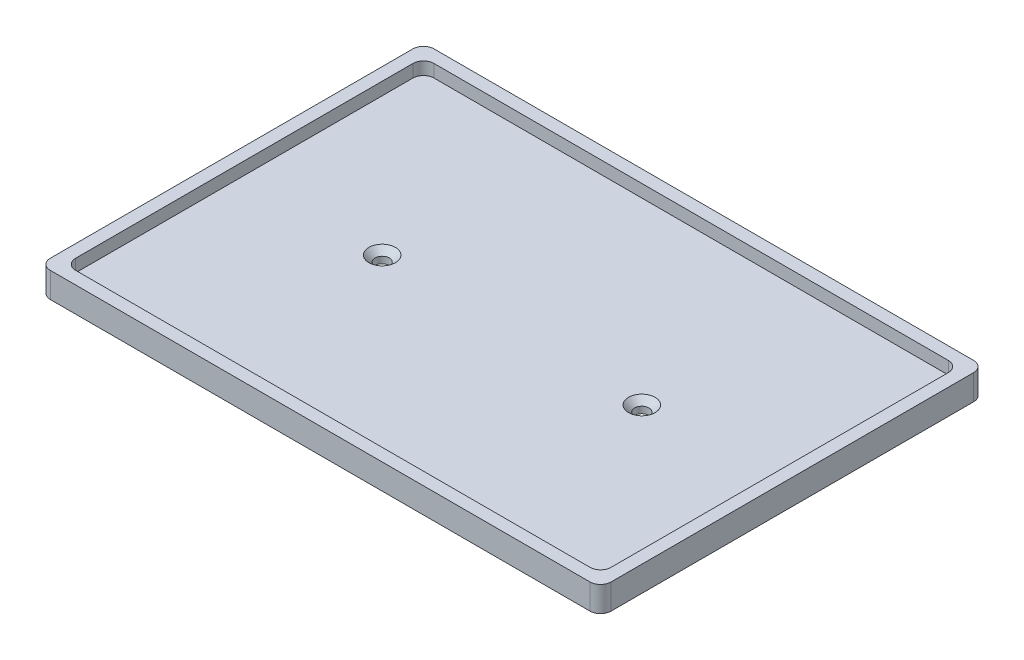
ISO-10303-21;
HEADER;
FILE_DESCRIPTION(('STEP AP214'),'2;1');
FILE_NAME('part.step','',(''),(''),'','','');
FILE_SCHEMA(('AUTOMOTIVE_DESIGN { 1 0 10303 214 1 1 1 1 }'));
ENDSEC;
DATA;
#1=APPLICATION_CONTEXT('core data for automotive mechanical design processes');
#2=APPLICATION_PROTOCOL_DEFINITION('international standard','automotive_design',2000,#1);
#3=PRODUCT_CONTEXT('',#1,'mechanical');
#4=PRODUCT('Part','Part','',(#3));
#5=PRODUCT_RELATED_PRODUCT_CATEGORY('part','',(#4));
#6=PRODUCT_DEFINITION_FORMATION('','',#4);
#7=PRODUCT_DEFINITION_CONTEXT('part definition',#1,'design');
#8=PRODUCT_DEFINITION('design','',#6,#7);
#9=PRODUCT_DEFINITION_SHAPE('','',#8);
#10=(LENGTH_UNIT() NAMED_UNIT(*) SI_UNIT(.MILLI.,.METRE.));
#11=(NAMED_UNIT(*) PLANE_ANGLE_UNIT() SI_UNIT($,.RADIAN.));
#12=(NAMED_UNIT(*) SI_UNIT($,.STERADIAN.) SOLID_ANGLE_UNIT());
#13=UNCERTAINTY_MEASURE_WITH_UNIT(LENGTH_MEASURE(1.E-05),#10,'distance_accuracy_value','');
#14=(GEOMETRIC_REPRESENTATION_CONTEXT(3) GLOBAL_UNCERTAINTY_ASSIGNED_CONTEXT((#13)) GLOBAL_UNIT_ASSIGNED_CONTEXT((#10,
#11,#12)) REPRESENTATION_CONTEXT('',''));
#15=CARTESIAN_POINT('',(0.,0.,0.));
#16=DIRECTION('',(0.,0.,1.));
#17=DIRECTION('',(1.,0.,0.));
#18=AXIS2_PLACEMENT_3D('',#15,#16,#17);
#19=CARTESIAN_POINT('',(66.5,6.,-45.5));
#20=DIRECTION('',(-1.,0.,0.));
#21=DIRECTION('',(0.,0.,1.));
#22=AXIS2_PLACEMENT_3D('',#19,#20,#21);
#23=PLANE('',#22);
#24=DIRECTION('',(0.,0.,-1.));
#25=VECTOR('',#24,1.);
#26=CARTESIAN_POINT('',(66.5,0.,-45.5));
#27=LINE('',#26,#25);
#28=CARTESIAN_POINT('',(66.5,0.,43.));
#29=VERTEX_POINT('',#28);
#30=CARTESIAN_POINT('',(66.5,0.,-43.));
#31=VERTEX_POINT('',#30);
#32=EDGE_CURVE('E180',#29,#31,#27,.T.);
#33=ORIENTED_EDGE('',*,*,#32,.T.);
#34=DIRECTION('',(0.,-1.,0.));
#35=VECTOR('',#34,1.);
#36=CARTESIAN_POINT('',(66.5,6.,-43.));
#37=LINE('',#36,#35);
#38=CARTESIAN_POINT('',(66.5,6.,-43.));
#39=VERTEX_POINT('',#38);
#40=EDGE_CURVE('E158',#31,#39,#37,.F.);
#41=ORIENTED_EDGE('',*,*,#40,.T.);
#42=DIRECTION('',(0.,0.,-1.));
#43=VECTOR('',#42,1.);
#44=CARTESIAN_POINT('',(66.5,6.,-45.5));
#45=LINE('',#44,#43);
#46=CARTESIAN_POINT('',(66.5,6.,43.));
#47=VERTEX_POINT('',#46);
#48=EDGE_CURVE('E191',#47,#39,#45,.T.);
#49=ORIENTED_EDGE('',*,*,#48,.F.);
#50=DIRECTION('',(0.,-1.,0.));
#51=VECTOR('',#50,1.);
#52=CARTESIAN_POINT('',(66.5,6.,43.));
#53=LINE('',#52,#51);
#54=EDGE_CURVE('E163',#47,#29,#53,.T.);
#55=ORIENTED_EDGE('',*,*,#54,.T.);
#56=EDGE_LOOP('',(#33,#41,#49,#55));
#57=FACE_BOUND('',#56,.T.);
#58=ADVANCED_FACE('F37',(#57),#23,.F.);
#59=CARTESIAN_POINT('',(-66.5,6.,-45.5));
#60=DIRECTION('',(0.,0.,1.));
#61=DIRECTION('',(1.,0.,0.));
#62=AXIS2_PLACEMENT_3D('',#59,#60,#61);
#63=PLANE('',#62);
#64=DIRECTION('',(-1.,0.,0.));
#65=VECTOR('',#64,1.);
#66=CARTESIAN_POINT('',(-66.5,6.,-45.5));
#67=LINE('',#66,#65);
#68=CARTESIAN_POINT('',(64.,6.,-45.5));
#69=VERTEX_POINT('',#68);
#70=CARTESIAN_POINT('',(-64.,6.,-45.5));
#71=VERTEX_POINT('',#70);
#72=EDGE_CURVE('E173',#69,#71,#67,.T.);
#73=ORIENTED_EDGE('',*,*,#72,.F.);
#74=DIRECTION('',(0.,-1.,0.));
#75=VECTOR('',#74,1.);
#76=CARTESIAN_POINT('',(64.,6.,-45.5));
#77=LINE('',#76,#75);
#78=CARTESIAN_POINT('',(64.,0.,-45.5));
#79=VERTEX_POINT('',#78);
#80=EDGE_CURVE('E157',#69,#79,#77,.T.);
#81=ORIENTED_EDGE('',*,*,#80,.T.);
#82=DIRECTION('',(-1.,0.,0.));
#83=VECTOR('',#82,1.);
#84=CARTESIAN_POINT('',(-66.5,0.,-45.5));
#85=LINE('',#84,#83);
#86=CARTESIAN_POINT('',(-64.,0.,-45.5));
#87=VERTEX_POINT('',#86);
#88=EDGE_CURVE('E170',#79,#87,#85,.T.);
#89=ORIENTED_EDGE('',*,*,#88,.T.);
#90=DIRECTION('',(0.,-1.,0.));
#91=VECTOR('',#90,1.);
#92=CARTESIAN_POINT('',(-64.,6.,-45.5));
#93=LINE('',#92,#91);
#94=EDGE_CURVE('E175',#87,#71,#93,.F.);
#95=ORIENTED_EDGE('',*,*,#94,.T.);
#96=EDGE_LOOP('',(#73,#81,#89,#95));
#97=FACE_BOUND('',#96,.T.);
#98=ADVANCED_FACE('F169',(#97),#63,.F.);
#99=CARTESIAN_POINT('',(-66.5,6.,-45.5));
#100=DIRECTION('',(1.,0.,0.));
#101=DIRECTION('',(0.,0.,-1.));
#102=AXIS2_PLACEMENT_3D('',#99,#100,#101);
#103=PLANE('',#102);
#104=DIRECTION('',(0.,0.,1.));
#105=VECTOR('',#104,1.);
#106=CARTESIAN_POINT('',(-66.5,6.,-45.5));
#107=LINE('',#106,#105);
#108=CARTESIAN_POINT('',(-66.5,6.,-43.));
#109=VERTEX_POINT('',#108);
#110=CARTESIAN_POINT('',(-66.5,6.,43.));
#111=VERTEX_POINT('',#110);
#112=EDGE_CURVE('E286',#109,#111,#107,.T.);
#113=ORIENTED_EDGE('',*,*,#112,.F.);
#114=DIRECTION('',(0.,-1.,0.));
#115=VECTOR('',#114,1.);
#116=CARTESIAN_POINT('',(-66.5,6.,-43.));
#117=LINE('',#116,#115);
#118=CARTESIAN_POINT('',(-66.5,0.,-43.));
#119=VERTEX_POINT('',#118);
#120=EDGE_CURVE('E237',#109,#119,#117,.T.);
#121=ORIENTED_EDGE('',*,*,#120,.T.);
#122=DIRECTION('',(0.,0.,1.));
#123=VECTOR('',#122,1.);
#124=CARTESIAN_POINT('',(-66.5,0.,-45.5));
#125=LINE('',#124,#123);
#126=CARTESIAN_POINT('',(-66.5,0.,43.));
#127=VERTEX_POINT('',#126);
#128=EDGE_CURVE('E179',#119,#127,#125,.T.);
#129=ORIENTED_EDGE('',*,*,#128,.T.);
#130=DIRECTION('',(0.,-1.,0.));
#131=VECTOR('',#130,1.);
#132=CARTESIAN_POINT('',(-66.5,6.,43.));
#133=LINE('',#132,#131);
#134=EDGE_CURVE('E235',#127,#111,#133,.F.);
#135=ORIENTED_EDGE('',*,*,#134,.T.);
#136=EDGE_LOOP('',(#113,#121,#129,#135));
#137=FACE_BOUND('',#136,.T.);
#138=ADVANCED_FACE('F308',(#137),#103,.F.);
#139=CARTESIAN_POINT('',(-66.5,6.,45.5));
#140=DIRECTION('',(0.,0.,-1.));
#141=DIRECTION('',(-1.,0.,0.));
#142=AXIS2_PLACEMENT_3D('',#139,#140,#141);
#143=PLANE('',#142);
#144=DIRECTION('',(1.,0.,0.));
#145=VECTOR('',#144,1.);
#146=CARTESIAN_POINT('',(-66.5,0.,45.5));
#147=LINE('',#146,#145);
#148=CARTESIAN_POINT('',(-64.,0.,45.5));
#149=VERTEX_POINT('',#148);
#150=CARTESIAN_POINT('',(64.,0.,45.5));
#151=VERTEX_POINT('',#150);
#152=EDGE_CURVE('E183',#149,#151,#147,.T.);
#153=ORIENTED_EDGE('',*,*,#152,.T.);
#154=DIRECTION('',(0.,-1.,0.));
#155=VECTOR('',#154,1.);
#156=CARTESIAN_POINT('',(64.,6.,45.5));
#157=LINE('',#156,#155);
#158=CARTESIAN_POINT('',(64.,6.,45.5));
#159=VERTEX_POINT('',#158);
#160=EDGE_CURVE('E243',#151,#159,#157,.F.);
#161=ORIENTED_EDGE('',*,*,#160,.T.);
#162=DIRECTION('',(1.,0.,0.));
#163=VECTOR('',#162,1.);
#164=CARTESIAN_POINT('',(-66.5,6.,45.5));
#165=LINE('',#164,#163);
#166=CARTESIAN_POINT('',(-64.,6.,45.5));
#167=VERTEX_POINT('',#166);
#168=EDGE_CURVE('E192',#167,#159,#165,.T.);
#169=ORIENTED_EDGE('',*,*,#168,.F.);
#170=DIRECTION('',(0.,-1.,0.));
#171=VECTOR('',#170,1.);
#172=CARTESIAN_POINT('',(-64.,6.,45.5));
#173=LINE('',#172,#171);
#174=EDGE_CURVE('E240',#167,#149,#173,.T.);
#175=ORIENTED_EDGE('',*,*,#174,.T.);
#176=EDGE_LOOP('',(#153,#161,#169,#175));
#177=FACE_BOUND('',#176,.T.);
#178=ADVANCED_FACE('F303',(#177),#143,.F.);
#179=CARTESIAN_POINT('',(0.,6.,0.));
#180=DIRECTION('',(0.,1.,0.));
#181=DIRECTION('',(0.,0.,1.));
#182=AXIS2_PLACEMENT_3D('',#179,#180,#181);
#183=PLANE('',#182);
#184=DIRECTION('',(0.,0.,-1.));
#185=VECTOR('',#184,1.);
#186=CARTESIAN_POINT('',(63.5,6.,-42.5));
#187=LINE('',#186,#185);
#188=CARTESIAN_POINT('',(63.5,6.,40.));
#189=VERTEX_POINT('',#188);
#190=CARTESIAN_POINT('',(63.5,6.,-40.));
#191=VERTEX_POINT('',#190);
#192=EDGE_CURVE('E251',#189,#191,#187,.T.);
#193=ORIENTED_EDGE('',*,*,#192,.F.);
#194=CARTESIAN_POINT('',(61.,6.,40.));
#195=DIRECTION('',(0.,1.,0.));
#196=DIRECTION('',(0.,0.,1.));
#197=AXIS2_PLACEMENT_3D('',#194,#195,#196);
#198=CIRCLE('',#197,2.5);
#199=CARTESIAN_POINT('',(61.,6.,42.5));
#200=VERTEX_POINT('',#199);
#201=EDGE_CURVE('E247',#189,#200,#198,.F.);
#202=ORIENTED_EDGE('',*,*,#201,.T.);
#203=DIRECTION('',(1.,0.,0.));
#204=VECTOR('',#203,1.);
#205=CARTESIAN_POINT('',(-63.5,6.,42.5));
#206=LINE('',#205,#204);
#207=CARTESIAN_POINT('',(-61.,6.,42.5));
#208=VERTEX_POINT('',#207);
#209=EDGE_CURVE('E271',#208,#200,#206,.T.);
#210=ORIENTED_EDGE('',*,*,#209,.F.);
#211=CARTESIAN_POINT('',(-61.,6.,40.));
#212=DIRECTION('',(0.,1.,0.));
#213=DIRECTION('',(0.,0.,1.));
#214=AXIS2_PLACEMENT_3D('',#211,#212,#213);
#215=CIRCLE('',#214,2.5);
#216=CARTESIAN_POINT('',(-63.5,6.,40.));
#217=VERTEX_POINT('',#216);
#218=EDGE_CURVE('E46',#208,#217,#215,.F.);
#219=ORIENTED_EDGE('',*,*,#218,.T.);
#220=DIRECTION('',(0.,0.,1.));
#221=VECTOR('',#220,1.);
#222=CARTESIAN_POINT('',(-63.5,6.,-42.5));
#223=LINE('',#222,#221);
#224=CARTESIAN_POINT('',(-63.5,6.,-40.));
#225=VERTEX_POINT('',#224);
#226=EDGE_CURVE('E279',#225,#217,#223,.T.);
#227=ORIENTED_EDGE('',*,*,#226,.F.);
#228=CARTESIAN_POINT('',(-61.,6.,-40.));
#229=DIRECTION('',(0.,1.,0.));
#230=DIRECTION('',(0.,0.,1.));
#231=AXIS2_PLACEMENT_3D('',#228,#229,#230);
#232=CIRCLE('',#231,2.5);
#233=CARTESIAN_POINT('',(-61.,6.,-42.5));
#234=VERTEX_POINT('',#233);
#235=EDGE_CURVE('E11',#225,#234,#232,.F.);
#236=ORIENTED_EDGE('',*,*,#235,.T.);
#237=DIRECTION('',(-1.,0.,0.));
#238=VECTOR('',#237,1.);
#239=CARTESIAN_POINT('',(-63.5,6.,-42.5));
#240=LINE('',#239,#238);
#241=CARTESIAN_POINT('',(61.,6.,-42.5));
#242=VERTEX_POINT('',#241);
#243=EDGE_CURVE('E256',#242,#234,#240,.T.);
#244=ORIENTED_EDGE('',*,*,#243,.F.);
#245=CARTESIAN_POINT('',(61.,6.,-40.));
#246=DIRECTION('',(0.,1.,0.));
#247=DIRECTION('',(0.,0.,1.));
#248=AXIS2_PLACEMENT_3D('',#245,#246,#247);
#249=CIRCLE('',#248,2.5);
#250=EDGE_CURVE('E245',#242,#191,#249,.F.);
#251=ORIENTED_EDGE('',*,*,#250,.T.);
#252=EDGE_LOOP('',(#193,#202,#210,#219,#227,#236,#244,#251));
#253=FACE_BOUND('',#252,.T.);
#254=ORIENTED_EDGE('',*,*,#48,.T.);
#255=CARTESIAN_POINT('',(64.,6.,-43.));
#256=DIRECTION('',(0.,1.,0.));
#257=DIRECTION('',(0.,0.,1.));
#258=AXIS2_PLACEMENT_3D('',#255,#256,#257);
#259=CIRCLE('',#258,2.5);
#260=EDGE_CURVE('E207',#39,#69,#259,.T.);
#261=ORIENTED_EDGE('',*,*,#260,.T.);
#262=ORIENTED_EDGE('',*,*,#72,.T.);
#263=CARTESIAN_POINT('',(-64.,6.,-43.));
#264=DIRECTION('',(0.,1.,0.));
#265=DIRECTION('',(0.,0.,1.));
#266=AXIS2_PLACEMENT_3D('',#263,#264,#265);
#267=CIRCLE('',#266,2.5);
#268=EDGE_CURVE('E205',#71,#109,#267,.T.);
#269=ORIENTED_EDGE('',*,*,#268,.T.);
#270=ORIENTED_EDGE('',*,*,#112,.T.);
#271=CARTESIAN_POINT('',(-64.,6.,43.));
#272=DIRECTION('',(0.,1.,0.));
#273=DIRECTION('',(0.,0.,1.));
#274=AXIS2_PLACEMENT_3D('',#271,#272,#273);
#275=CIRCLE('',#274,2.5);
#276=EDGE_CURVE('E201',#111,#167,#275,.T.);
#277=ORIENTED_EDGE('',*,*,#276,.T.);
#278=ORIENTED_EDGE('',*,*,#168,.T.);
#279=CARTESIAN_POINT('',(64.,6.,43.));
#280=DIRECTION('',(0.,1.,0.));
#281=DIRECTION('',(0.,0.,1.));
#282=AXIS2_PLACEMENT_3D('',#279,#280,#281);
#283=CIRCLE('',#282,2.5);
#284=EDGE_CURVE('E203',#159,#47,#283,.T.);
#285=ORIENTED_EDGE('',*,*,#284,.T.);
#286=EDGE_LOOP('',(#254,#261,#262,#269,#270,#277,#278,#285));
#287=FACE_BOUND('',#286,.T.);
#288=ADVANCED_FACE('F292',(#253,#287),#183,.T.);
#289=CARTESIAN_POINT('',(0.,0.,0.));
#290=DIRECTION('',(0.,1.,0.));
#291=DIRECTION('',(0.,0.,1.));
#292=AXIS2_PLACEMENT_3D('',#289,#290,#291);
#293=PLANE('',#292);
#294=CARTESIAN_POINT('',(-30.8,0.,0.));
#295=DIRECTION('',(0.,1.,0.));
#296=DIRECTION('',(0.,0.,1.));
#297=AXIS2_PLACEMENT_3D('',#294,#295,#296);
#298=CIRCLE('',#297,1.7);
#299=CARTESIAN_POINT('',(-30.8,0.,1.7));
#300=VERTEX_POINT('',#299);
#301=EDGE_CURVE('E41',#300,#300,#298,.T.);
#302=ORIENTED_EDGE('',*,*,#301,.T.);
#303=EDGE_LOOP('',(#302));
#304=FACE_BOUND('',#303,.T.);
#305=CARTESIAN_POINT('',(30.8,0.,0.));
#306=DIRECTION('',(0.,1.,0.));
#307=DIRECTION('',(0.,0.,1.));
#308=AXIS2_PLACEMENT_3D('',#305,#306,#307);
#309=CIRCLE('',#308,1.7);
#310=CARTESIAN_POINT('',(30.8,0.,1.69999999999999));
#311=VERTEX_POINT('',#310);
#312=EDGE_CURVE('E249',#311,#311,#309,.T.);
#313=ORIENTED_EDGE('',*,*,#312,.T.);
#314=EDGE_LOOP('',(#313));
#315=FACE_BOUND('',#314,.T.);
#316=ORIENTED_EDGE('',*,*,#88,.F.);
#317=CARTESIAN_POINT('',(64.,0.,-43.));
#318=DIRECTION('',(0.,1.,0.));
#319=DIRECTION('',(0.,0.,1.));
#320=AXIS2_PLACEMENT_3D('',#317,#318,#319);
#321=CIRCLE('',#320,2.5);
#322=EDGE_CURVE('E153',#79,#31,#321,.F.);
#323=ORIENTED_EDGE('',*,*,#322,.T.);
#324=ORIENTED_EDGE('',*,*,#32,.F.);
#325=CARTESIAN_POINT('',(64.,0.,43.));
#326=DIRECTION('',(0.,1.,0.));
#327=DIRECTION('',(0.,0.,1.));
#328=AXIS2_PLACEMENT_3D('',#325,#326,#327);
#329=CIRCLE('',#328,2.5);
#330=EDGE_CURVE('E195',#29,#151,#329,.F.);
#331=ORIENTED_EDGE('',*,*,#330,.T.);
#332=ORIENTED_EDGE('',*,*,#152,.F.);
#333=CARTESIAN_POINT('',(-64.,0.,43.));
#334=DIRECTION('',(0.,1.,0.));
#335=DIRECTION('',(0.,0.,1.));
#336=AXIS2_PLACEMENT_3D('',#333,#334,#335);
#337=CIRCLE('',#336,2.5);
#338=EDGE_CURVE('E174',#149,#127,#337,.F.);
#339=ORIENTED_EDGE('',*,*,#338,.T.);
#340=ORIENTED_EDGE('',*,*,#128,.F.);
#341=CARTESIAN_POINT('',(-64.,0.,-43.));
#342=DIRECTION('',(0.,1.,0.));
#343=DIRECTION('',(0.,0.,1.));
#344=AXIS2_PLACEMENT_3D('',#341,#342,#343);
#345=CIRCLE('',#344,2.5);
#346=EDGE_CURVE('E164',#119,#87,#345,.F.);
#347=ORIENTED_EDGE('',*,*,#346,.T.);
#348=EDGE_LOOP('',(#316,#323,#324,#331,#332,#339,#340,#347));
#349=FACE_BOUND('',#348,.T.);
#350=ADVANCED_FACE('F177',(#304,#315,#349),#293,.F.);
#351=CARTESIAN_POINT('',(63.5,3.,-42.5));
#352=DIRECTION('',(1.,0.,0.));
#353=DIRECTION('',(0.,0.,-1.));
#354=AXIS2_PLACEMENT_3D('',#351,#352,#353);
#355=PLANE('',#354);
#356=ORIENTED_EDGE('',*,*,#192,.T.);
#357=DIRECTION('',(0.,1.,0.));
#358=VECTOR('',#357,1.);
#359=CARTESIAN_POINT('',(63.5,3.,-40.));
#360=LINE('',#359,#358);
#361=CARTESIAN_POINT('',(63.5,3.,-40.));
#362=VERTEX_POINT('',#361);
#363=EDGE_CURVE('E217',#191,#362,#360,.F.);
#364=ORIENTED_EDGE('',*,*,#363,.T.);
#365=DIRECTION('',(0.,0.,-1.));
#366=VECTOR('',#365,1.);
#367=CARTESIAN_POINT('',(63.5,3.,-42.5));
#368=LINE('',#367,#366);
#369=CARTESIAN_POINT('',(63.5,3.,40.));
#370=VERTEX_POINT('',#369);
#371=EDGE_CURVE('E267',#370,#362,#368,.T.);
#372=ORIENTED_EDGE('',*,*,#371,.F.);
#373=DIRECTION('',(0.,1.,0.));
#374=VECTOR('',#373,1.);
#375=CARTESIAN_POINT('',(63.5,6.,40.));
#376=LINE('',#375,#374);
#377=EDGE_CURVE('E214',#370,#189,#376,.T.);
#378=ORIENTED_EDGE('',*,*,#377,.T.);
#379=EDGE_LOOP('',(#356,#364,#372,#378));
#380=FACE_BOUND('',#379,.T.);
#381=ADVANCED_FACE('F350',(#380),#355,.F.);
#382=CARTESIAN_POINT('',(-63.5,3.,42.5));
#383=DIRECTION('',(0.,0.,1.));
#384=DIRECTION('',(1.,0.,0.));
#385=AXIS2_PLACEMENT_3D('',#382,#383,#384);
#386=PLANE('',#385);
#387=ORIENTED_EDGE('',*,*,#209,.T.);
#388=DIRECTION('',(0.,1.,0.));
#389=VECTOR('',#388,1.);
#390=CARTESIAN_POINT('',(61.,3.,42.5));
#391=LINE('',#390,#389);
#392=CARTESIAN_POINT('',(61.,3.,42.5));
#393=VERTEX_POINT('',#392);
#394=EDGE_CURVE('E54',#200,#393,#391,.F.);
#395=ORIENTED_EDGE('',*,*,#394,.T.);
#396=DIRECTION('',(1.,0.,0.));
#397=VECTOR('',#396,1.);
#398=CARTESIAN_POINT('',(-63.5,3.,42.5));
#399=LINE('',#398,#397);
#400=CARTESIAN_POINT('',(-61.,3.,42.5));
#401=VERTEX_POINT('',#400);
#402=EDGE_CURVE('E185',#401,#393,#399,.T.);
#403=ORIENTED_EDGE('',*,*,#402,.F.);
#404=DIRECTION('',(0.,1.,0.));
#405=VECTOR('',#404,1.);
#406=CARTESIAN_POINT('',(-61.,6.,42.5));
#407=LINE('',#406,#405);
#408=EDGE_CURVE('E226',#401,#208,#407,.T.);
#409=ORIENTED_EDGE('',*,*,#408,.T.);
#410=EDGE_LOOP('',(#387,#395,#403,#409));
#411=FACE_BOUND('',#410,.T.);
#412=ADVANCED_FACE('F368',(#411),#386,.F.);
#413=CARTESIAN_POINT('',(-63.5,3.,-42.5));
#414=DIRECTION('',(-1.,0.,0.));
#415=DIRECTION('',(0.,0.,1.));
#416=AXIS2_PLACEMENT_3D('',#413,#414,#415);
#417=PLANE('',#416);
#418=ORIENTED_EDGE('',*,*,#226,.T.);
#419=DIRECTION('',(0.,1.,0.));
#420=VECTOR('',#419,1.);
#421=CARTESIAN_POINT('',(-63.5,3.,40.));
#422=LINE('',#421,#420);
#423=CARTESIAN_POINT('',(-63.5,3.,40.));
#424=VERTEX_POINT('',#423);
#425=EDGE_CURVE('E233',#217,#424,#422,.F.);
#426=ORIENTED_EDGE('',*,*,#425,.T.);
#427=DIRECTION('',(0.,0.,1.));
#428=VECTOR('',#427,1.);
#429=CARTESIAN_POINT('',(-63.5,3.,-42.5));
#430=LINE('',#429,#428);
#431=CARTESIAN_POINT('',(-63.5,3.,-40.));
#432=VERTEX_POINT('',#431);
#433=EDGE_CURVE('E274',#432,#424,#430,.T.);
#434=ORIENTED_EDGE('',*,*,#433,.F.);
#435=DIRECTION('',(0.,1.,0.));
#436=VECTOR('',#435,1.);
#437=CARTESIAN_POINT('',(-63.5,6.,-40.));
#438=LINE('',#437,#436);
#439=EDGE_CURVE('E230',#432,#225,#438,.T.);
#440=ORIENTED_EDGE('',*,*,#439,.T.);
#441=EDGE_LOOP('',(#418,#426,#434,#440));
#442=FACE_BOUND('',#441,.T.);
#443=ADVANCED_FACE('F363',(#442),#417,.F.);
#444=CARTESIAN_POINT('',(-63.5,3.,-42.5));
#445=DIRECTION('',(0.,0.,-1.));
#446=DIRECTION('',(-1.,0.,0.));
#447=AXIS2_PLACEMENT_3D('',#444,#445,#446);
#448=PLANE('',#447);
#449=DIRECTION('',(-1.,0.,0.));
#450=VECTOR('',#449,1.);
#451=CARTESIAN_POINT('',(-63.5,3.,-42.5));
#452=LINE('',#451,#450);
#453=CARTESIAN_POINT('',(61.,3.,-42.5));
#454=VERTEX_POINT('',#453);
#455=CARTESIAN_POINT('',(-61.,3.,-42.5));
#456=VERTEX_POINT('',#455);
#457=EDGE_CURVE('E270',#454,#456,#452,.T.);
#458=ORIENTED_EDGE('',*,*,#457,.F.);
#459=DIRECTION('',(0.,1.,0.));
#460=VECTOR('',#459,1.);
#461=CARTESIAN_POINT('',(61.,6.,-42.5));
#462=LINE('',#461,#460);
#463=EDGE_CURVE('E211',#454,#242,#462,.T.);
#464=ORIENTED_EDGE('',*,*,#463,.T.);
#465=ORIENTED_EDGE('',*,*,#243,.T.);
#466=DIRECTION('',(0.,1.,0.));
#467=VECTOR('',#466,1.);
#468=CARTESIAN_POINT('',(-61.,3.,-42.5));
#469=LINE('',#468,#467);
#470=EDGE_CURVE('E209',#234,#456,#469,.F.);
#471=ORIENTED_EDGE('',*,*,#470,.T.);
#472=EDGE_LOOP('',(#458,#464,#465,#471));
#473=FACE_BOUND('',#472,.T.);
#474=ADVANCED_FACE('F357',(#473),#448,.F.);
#475=CARTESIAN_POINT('',(0.,3.,0.));
#476=DIRECTION('',(0.,1.,0.));
#477=DIRECTION('',(0.,0.,1.));
#478=AXIS2_PLACEMENT_3D('',#475,#476,#477);
#479=PLANE('',#478);
#480=CARTESIAN_POINT('',(-30.8,3.,0.));
#481=DIRECTION('',(0.,1.,0.));
#482=DIRECTION('',(0.,0.,1.));
#483=AXIS2_PLACEMENT_3D('',#480,#481,#482);
#484=CIRCLE('',#483,3.15);
#485=CARTESIAN_POINT('',(-30.8,3.,3.15000000000001));
#486=VERTEX_POINT('',#485);
#487=EDGE_CURVE('E590',#486,#486,#484,.T.);
#488=ORIENTED_EDGE('',*,*,#487,.F.);
#489=EDGE_LOOP('',(#488));
#490=FACE_BOUND('',#489,.T.);
#491=CARTESIAN_POINT('',(30.8,3.,0.));
#492=DIRECTION('',(0.,1.,0.));
#493=DIRECTION('',(0.,0.,1.));
#494=AXIS2_PLACEMENT_3D('',#491,#492,#493);
#495=CIRCLE('',#494,3.15);
#496=CARTESIAN_POINT('',(30.8,3.,3.14999999999999));
#497=VERTEX_POINT('',#496);
#498=EDGE_CURVE('E259',#497,#497,#495,.T.);
#499=ORIENTED_EDGE('',*,*,#498,.F.);
#500=EDGE_LOOP('',(#499));
#501=FACE_BOUND('',#500,.T.);
#502=ORIENTED_EDGE('',*,*,#371,.T.);
#503=CARTESIAN_POINT('',(61.,3.,-40.));
#504=DIRECTION('',(0.,1.,0.));
#505=DIRECTION('',(0.,0.,1.));
#506=AXIS2_PLACEMENT_3D('',#503,#504,#505);
#507=CIRCLE('',#506,2.5);
#508=EDGE_CURVE('E224',#362,#454,#507,.T.);
#509=ORIENTED_EDGE('',*,*,#508,.T.);
#510=ORIENTED_EDGE('',*,*,#457,.T.);
#511=CARTESIAN_POINT('',(-61.,3.,-40.));
#512=DIRECTION('',(0.,1.,0.));
#513=DIRECTION('',(0.,0.,1.));
#514=AXIS2_PLACEMENT_3D('',#511,#512,#513);
#515=CIRCLE('',#514,2.5);
#516=EDGE_CURVE('E219',#456,#432,#515,.T.);
#517=ORIENTED_EDGE('',*,*,#516,.T.);
#518=ORIENTED_EDGE('',*,*,#433,.T.);
#519=CARTESIAN_POINT('',(-61.,3.,40.));
#520=DIRECTION('',(0.,1.,0.));
#521=DIRECTION('',(0.,0.,1.));
#522=AXIS2_PLACEMENT_3D('',#519,#520,#521);
#523=CIRCLE('',#522,2.5);
#524=EDGE_CURVE('E61',#424,#401,#523,.T.);
#525=ORIENTED_EDGE('',*,*,#524,.T.);
#526=ORIENTED_EDGE('',*,*,#402,.T.);
#527=CARTESIAN_POINT('',(61.,3.,40.));
#528=DIRECTION('',(0.,1.,0.));
#529=DIRECTION('',(0.,0.,1.));
#530=AXIS2_PLACEMENT_3D('',#527,#528,#529);
#531=CIRCLE('',#530,2.5);
#532=EDGE_CURVE('E222',#393,#370,#531,.T.);
#533=ORIENTED_EDGE('',*,*,#532,.T.);
#534=EDGE_LOOP('',(#502,#509,#510,#517,#518,#525,#526,#533));
#535=FACE_BOUND('',#534,.T.);
#536=ADVANCED_FACE('F337',(#490,#501,#535),#479,.T.);
#537=CARTESIAN_POINT('',(64.,6.,-43.));
#538=DIRECTION('',(0.,-1.,0.));
#539=DIRECTION('',(0.,0.,-1.));
#540=AXIS2_PLACEMENT_3D('',#537,#538,#539);
#541=CYLINDRICAL_SURFACE('',#540,2.5);
#542=ORIENTED_EDGE('',*,*,#260,.F.);
#543=ORIENTED_EDGE('',*,*,#40,.F.);
#544=ORIENTED_EDGE('',*,*,#322,.F.);
#545=ORIENTED_EDGE('',*,*,#80,.F.);
#546=EDGE_LOOP('',(#542,#543,#544,#545));
#547=FACE_BOUND('',#546,.T.);
#548=ADVANCED_FACE('F156',(#547),#541,.T.);
#549=CARTESIAN_POINT('',(61.,3.,-40.));
#550=DIRECTION('',(0.,-1.,0.));
#551=DIRECTION('',(0.,0.,-1.));
#552=AXIS2_PLACEMENT_3D('',#549,#550,#551);
#553=CYLINDRICAL_SURFACE('',#552,2.5);
#554=ORIENTED_EDGE('',*,*,#508,.F.);
#555=ORIENTED_EDGE('',*,*,#363,.F.);
#556=ORIENTED_EDGE('',*,*,#250,.F.);
#557=ORIENTED_EDGE('',*,*,#463,.F.);
#558=EDGE_LOOP('',(#554,#555,#556,#557));
#559=FACE_BOUND('',#558,.T.);
#560=ADVANCED_FACE('F336',(#559),#553,.F.);
#561=CARTESIAN_POINT('',(61.,3.,40.));
#562=DIRECTION('',(0.,-1.,0.));
#563=DIRECTION('',(0.,0.,-1.));
#564=AXIS2_PLACEMENT_3D('',#561,#562,#563);
#565=CYLINDRICAL_SURFACE('',#564,2.5);
#566=ORIENTED_EDGE('',*,*,#532,.F.);
#567=ORIENTED_EDGE('',*,*,#394,.F.);
#568=ORIENTED_EDGE('',*,*,#201,.F.);
#569=ORIENTED_EDGE('',*,*,#377,.F.);
#570=EDGE_LOOP('',(#566,#567,#568,#569));
#571=FACE_BOUND('',#570,.T.);
#572=ADVANCED_FACE('F323',(#571),#565,.F.);
#573=CARTESIAN_POINT('',(-61.,3.,40.));
#574=DIRECTION('',(0.,-1.,0.));
#575=DIRECTION('',(0.,0.,-1.));
#576=AXIS2_PLACEMENT_3D('',#573,#574,#575);
#577=CYLINDRICAL_SURFACE('',#576,2.5);
#578=ORIENTED_EDGE('',*,*,#524,.F.);
#579=ORIENTED_EDGE('',*,*,#425,.F.);
#580=ORIENTED_EDGE('',*,*,#218,.F.);
#581=ORIENTED_EDGE('',*,*,#408,.F.);
#582=EDGE_LOOP('',(#578,#579,#580,#581));
#583=FACE_BOUND('',#582,.T.);
#584=ADVANCED_FACE('F315',(#583),#577,.F.);
#585=CARTESIAN_POINT('',(-64.,6.,-43.));
#586=DIRECTION('',(0.,-1.,0.));
#587=DIRECTION('',(0.,0.,-1.));
#588=AXIS2_PLACEMENT_3D('',#585,#586,#587);
#589=CYLINDRICAL_SURFACE('',#588,2.5);
#590=ORIENTED_EDGE('',*,*,#268,.F.);
#591=ORIENTED_EDGE('',*,*,#94,.F.);
#592=ORIENTED_EDGE('',*,*,#346,.F.);
#593=ORIENTED_EDGE('',*,*,#120,.F.);
#594=EDGE_LOOP('',(#590,#591,#592,#593));
#595=FACE_BOUND('',#594,.T.);
#596=ADVANCED_FACE('F312',(#595),#589,.T.);
#597=CARTESIAN_POINT('',(-61.,3.,-40.));
#598=DIRECTION('',(0.,-1.,0.));
#599=DIRECTION('',(0.,0.,-1.));
#600=AXIS2_PLACEMENT_3D('',#597,#598,#599);
#601=CYLINDRICAL_SURFACE('',#600,2.5);
#602=ORIENTED_EDGE('',*,*,#516,.F.);
#603=ORIENTED_EDGE('',*,*,#470,.F.);
#604=ORIENTED_EDGE('',*,*,#235,.F.);
#605=ORIENTED_EDGE('',*,*,#439,.F.);
#606=EDGE_LOOP('',(#602,#603,#604,#605));
#607=FACE_BOUND('',#606,.T.);
#608=ADVANCED_FACE('F314',(#607),#601,.F.);
#609=CARTESIAN_POINT('',(64.,6.,43.));
#610=DIRECTION('',(0.,-1.,0.));
#611=DIRECTION('',(0.,0.,-1.));
#612=AXIS2_PLACEMENT_3D('',#609,#610,#611);
#613=CYLINDRICAL_SURFACE('',#612,2.5);
#614=ORIENTED_EDGE('',*,*,#284,.F.);
#615=ORIENTED_EDGE('',*,*,#160,.F.);
#616=ORIENTED_EDGE('',*,*,#330,.F.);
#617=ORIENTED_EDGE('',*,*,#54,.F.);
#618=EDGE_LOOP('',(#614,#615,#616,#617));
#619=FACE_BOUND('',#618,.T.);
#620=ADVANCED_FACE('F300',(#619),#613,.T.);
#621=CARTESIAN_POINT('',(-64.,6.,43.));
#622=DIRECTION('',(0.,-1.,0.));
#623=DIRECTION('',(0.,0.,-1.));
#624=AXIS2_PLACEMENT_3D('',#621,#622,#623);
#625=CYLINDRICAL_SURFACE('',#624,2.5);
#626=ORIENTED_EDGE('',*,*,#276,.F.);
#627=ORIENTED_EDGE('',*,*,#134,.F.);
#628=ORIENTED_EDGE('',*,*,#338,.F.);
#629=ORIENTED_EDGE('',*,*,#174,.F.);
#630=EDGE_LOOP('',(#626,#627,#628,#629));
#631=FACE_BOUND('',#630,.T.);
#632=ADVANCED_FACE('F39',(#631),#625,.T.);
#633=CARTESIAN_POINT('',(30.8,3.,0.));
#634=DIRECTION('',(0.,1.,0.));
#635=DIRECTION('',(0.,0.,1.));
#636=AXIS2_PLACEMENT_3D('',#633,#634,#635);
#637=CYLINDRICAL_SURFACE('',#636,1.7);
#638=CARTESIAN_POINT('',(30.8,1.55,0.));
#639=DIRECTION('',(0.,1.,0.));
#640=DIRECTION('',(0.,0.,1.));
#641=AXIS2_PLACEMENT_3D('',#638,#639,#640);
#642=CIRCLE('',#641,1.7);
#643=CARTESIAN_POINT('',(30.8,1.55,1.69999999999999));
#644=VERTEX_POINT('',#643);
#645=EDGE_CURVE('E252',#644,#644,#642,.T.);
#646=ORIENTED_EDGE('',*,*,#645,.T.);
#647=EDGE_LOOP('',(#646));
#648=FACE_BOUND('',#647,.T.);
#649=ORIENTED_EDGE('',*,*,#312,.F.);
#650=EDGE_LOOP('',(#649));
#651=FACE_BOUND('',#650,.T.);
#652=ADVANCED_FACE('F488',(#648,#651),#637,.F.);
#653=CARTESIAN_POINT('',(30.8,3.,0.));
#654=DIRECTION('',(0.,1.,0.));
#655=DIRECTION('',(0.,0.,1.));
#656=AXIS2_PLACEMENT_3D('',#653,#654,#655);
#657=CONICAL_SURFACE('',#656,3.15,0.785398163397447);
#658=ORIENTED_EDGE('',*,*,#645,.F.);
#659=EDGE_LOOP('',(#658));
#660=FACE_BOUND('',#659,.T.);
#661=ORIENTED_EDGE('',*,*,#498,.T.);
#662=EDGE_LOOP('',(#661));
#663=FACE_BOUND('',#662,.T.);
#664=ADVANCED_FACE('F511',(#660,#663),#657,.F.);
#665=CARTESIAN_POINT('',(-30.8,3.,0.));
#666=DIRECTION('',(0.,1.,0.));
#667=DIRECTION('',(0.,0.,1.));
#668=AXIS2_PLACEMENT_3D('',#665,#666,#667);
#669=CYLINDRICAL_SURFACE('',#668,1.7);
#670=CARTESIAN_POINT('',(-30.8,1.55,0.));
#671=DIRECTION('',(0.,1.,0.));
#672=DIRECTION('',(0.,0.,1.));
#673=AXIS2_PLACEMENT_3D('',#670,#671,#672);
#674=CIRCLE('',#673,1.7);
#675=CARTESIAN_POINT('',(-30.8,1.55,1.7));
#676=VERTEX_POINT('',#675);
#677=EDGE_CURVE('E587',#676,#676,#674,.T.);
#678=ORIENTED_EDGE('',*,*,#677,.T.);
#679=EDGE_LOOP('',(#678));
#680=FACE_BOUND('',#679,.T.);
#681=ORIENTED_EDGE('',*,*,#301,.F.);
#682=EDGE_LOOP('',(#681));
#683=FACE_BOUND('',#682,.T.);
#684=ADVANCED_FACE('F521',(#680,#683),#669,.F.);
#685=CARTESIAN_POINT('',(-30.8,3.,0.));
#686=DIRECTION('',(0.,1.,0.));
#687=DIRECTION('',(0.,0.,1.));
#688=AXIS2_PLACEMENT_3D('',#685,#686,#687);
#689=CONICAL_SURFACE('',#688,3.15,0.785398163397448);
#690=ORIENTED_EDGE('',*,*,#677,.F.);
#691=EDGE_LOOP('',(#690));
#692=FACE_BOUND('',#691,.T.);
#693=ORIENTED_EDGE('',*,*,#487,.T.);
#694=EDGE_LOOP('',(#693));
#695=FACE_BOUND('',#694,.T.);
#696=ADVANCED_FACE('F532',(#692,#695),#689,.F.);
#697=CLOSED_SHELL('',(#58,#98,#138,#178,#288,#350,#381,#412,#443,#474,#536,#548,#560,#572,#584,
#596,#608,#620,#632,#652,#664,#684,#696));
#698=MANIFOLD_SOLID_BREP('B2',#697);
#699=ADVANCED_BREP_SHAPE_REPRESENTATION('',(#18,#698),#14);
#700=SHAPE_DEFINITION_REPRESENTATION(#9,#699);
ENDSEC;
END-ISO-10303-21;
